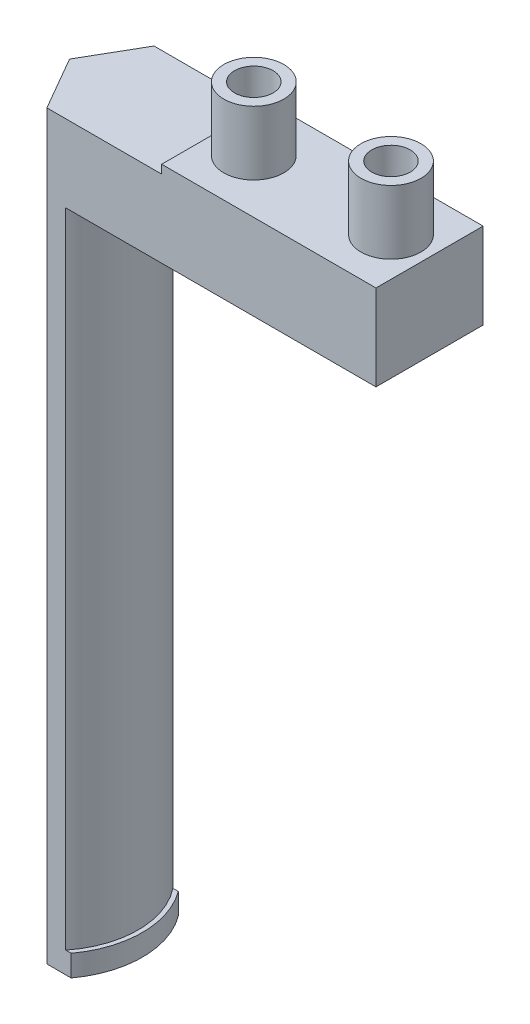
ISO-10303-21;
HEADER;
FILE_DESCRIPTION(('STEP AP214'),'2;1');
FILE_NAME('part.step','',(''),(''),'','','');
FILE_SCHEMA(('AUTOMOTIVE_DESIGN { 1 0 10303 214 1 1 1 1 }'));
ENDSEC;
DATA;
#1=APPLICATION_CONTEXT('core data for automotive mechanical design processes');
#2=APPLICATION_PROTOCOL_DEFINITION('international standard','automotive_design',2000,#1);
#3=PRODUCT_CONTEXT('',#1,'mechanical');
#4=PRODUCT('Part','Part','',(#3));
#5=PRODUCT_RELATED_PRODUCT_CATEGORY('part','',(#4));
#6=PRODUCT_DEFINITION_FORMATION('','',#4);
#7=PRODUCT_DEFINITION_CONTEXT('part definition',#1,'design');
#8=PRODUCT_DEFINITION('design','',#6,#7);
#9=PRODUCT_DEFINITION_SHAPE('','',#8);
#10=(LENGTH_UNIT() NAMED_UNIT(*) SI_UNIT(.MILLI.,.METRE.));
#11=(NAMED_UNIT(*) PLANE_ANGLE_UNIT() SI_UNIT($,.RADIAN.));
#12=(NAMED_UNIT(*) SI_UNIT($,.STERADIAN.) SOLID_ANGLE_UNIT());
#13=UNCERTAINTY_MEASURE_WITH_UNIT(LENGTH_MEASURE(1.E-05),#10,'distance_accuracy_value','');
#14=(GEOMETRIC_REPRESENTATION_CONTEXT(3) GLOBAL_UNCERTAINTY_ASSIGNED_CONTEXT((#13)) GLOBAL_UNIT_ASSIGNED_CONTEXT((#10,
#11,#12)) REPRESENTATION_CONTEXT('',''));
#15=CARTESIAN_POINT('',(0.,0.,0.));
#16=DIRECTION('',(0.,0.,1.));
#17=DIRECTION('',(1.,0.,0.));
#18=AXIS2_PLACEMENT_3D('',#15,#16,#17);
#19=CARTESIAN_POINT('',(-68.4126587736529,27.4010649474121,39.4980669589463));
#20=DIRECTION('',(0.86602540378444,0.,-0.499999999999998));
#21=DIRECTION('',(-0.499999999999998,0.,-0.86602540378444));
#22=AXIS2_PLACEMENT_3D('',#19,#20,#21);
#23=PLANE('',#22);
#24=DIRECTION('',(0.499999999999999,0.,0.86602540378444));
#25=VECTOR('',#24,1.);
#26=CARTESIAN_POINT('',(-68.4126587736529,-2.00000000000001,39.4980669589463));
#27=LINE('',#26,#25);
#28=CARTESIAN_POINT('',(-84.,-2.00000000000001,12.5));
#29=VERTEX_POINT('',#28);
#30=CARTESIAN_POINT('',(-76.7831216351297,-2.00000000000001,25.));
#31=VERTEX_POINT('',#30);
#32=EDGE_CURVE('E139',#29,#31,#27,.T.);
#33=ORIENTED_EDGE('',*,*,#32,.F.);
#34=DIRECTION('',(0.,-1.,0.));
#35=VECTOR('',#34,1.);
#36=CARTESIAN_POINT('',(-84.,27.4010649474121,12.5));
#37=LINE('',#36,#35);
#38=CARTESIAN_POINT('',(-84.,-175.,12.5));
#39=VERTEX_POINT('',#38);
#40=EDGE_CURVE('E66',#29,#39,#37,.T.);
#41=ORIENTED_EDGE('',*,*,#40,.T.);
#42=DIRECTION('',(-0.499999999999998,0.,-0.86602540378444));
#43=VECTOR('',#42,1.);
#44=CARTESIAN_POINT('',(-76.7831216351297,-175.,25.));
#45=LINE('',#44,#43);
#46=CARTESIAN_POINT('',(-76.7831216351297,-175.,25.));
#47=VERTEX_POINT('',#46);
#48=EDGE_CURVE('E162',#47,#39,#45,.T.);
#49=ORIENTED_EDGE('',*,*,#48,.F.);
#50=DIRECTION('',(0.,-1.,0.));
#51=VECTOR('',#50,1.);
#52=CARTESIAN_POINT('',(-76.7831216351297,27.4010649474121,25.));
#53=LINE('',#52,#51);
#54=EDGE_CURVE('E176',#31,#47,#53,.T.);
#55=ORIENTED_EDGE('',*,*,#54,.F.);
#56=EDGE_LOOP('',(#33,#41,#49,#55));
#57=FACE_BOUND('',#56,.T.);
#58=ADVANCED_FACE('F42',(#57),#23,.F.);
#59=CARTESIAN_POINT('',(-57.5873412263474,27.4010649474121,-33.2480669589463));
#60=DIRECTION('',(-0.86602540378444,0.,-0.499999999999998));
#61=DIRECTION('',(-0.499999999999998,0.,0.86602540378444));
#62=AXIS2_PLACEMENT_3D('',#59,#60,#61);
#63=PLANE('',#62);
#64=ORIENTED_EDGE('',*,*,#40,.F.);
#65=DIRECTION('',(-0.499999999999998,0.,0.86602540378444));
#66=VECTOR('',#65,1.);
#67=CARTESIAN_POINT('',(-57.5873412263475,-2.00000000000001,-33.2480669589463));
#68=LINE('',#67,#66);
#69=CARTESIAN_POINT('',(-76.7831216351297,-2.00000000000001,0.));
#70=VERTEX_POINT('',#69);
#71=EDGE_CURVE('E155',#70,#29,#68,.T.);
#72=ORIENTED_EDGE('',*,*,#71,.F.);
#73=DIRECTION('',(0.,-1.,0.));
#74=VECTOR('',#73,1.);
#75=CARTESIAN_POINT('',(-76.7831216351297,27.4010649474121,0.));
#76=LINE('',#75,#74);
#77=CARTESIAN_POINT('',(-76.7831216351297,-175.,0.));
#78=VERTEX_POINT('',#77);
#79=EDGE_CURVE('E175',#70,#78,#76,.T.);
#80=ORIENTED_EDGE('',*,*,#79,.T.);
#81=DIRECTION('',(0.499999999999997,0.,-0.866025403784441));
#82=VECTOR('',#81,1.);
#83=CARTESIAN_POINT('',(-84.,-175.,12.5));
#84=LINE('',#83,#82);
#85=EDGE_CURVE('E165',#39,#78,#84,.T.);
#86=ORIENTED_EDGE('',*,*,#85,.F.);
#87=EDGE_LOOP('',(#64,#72,#80,#86));
#88=FACE_BOUND('',#87,.T.);
#89=ADVANCED_FACE('F302',(#88),#63,.T.);
#90=CARTESIAN_POINT('',(0.,0.,0.));
#91=DIRECTION('',(0.,0.,1.));
#92=DIRECTION('',(1.,0.,0.));
#93=AXIS2_PLACEMENT_3D('',#90,#91,#92);
#94=PLANE('',#93);
#95=DIRECTION('',(-1.,0.,0.));
#96=VECTOR('',#95,1.);
#97=CARTESIAN_POINT('',(0.,-2.,0.));
#98=LINE('',#97,#96);
#99=CARTESIAN_POINT('',(-50.,-2.00000000000001,0.));
#100=VERTEX_POINT('',#99);
#101=EDGE_CURVE('E134',#100,#70,#98,.T.);
#102=ORIENTED_EDGE('',*,*,#101,.F.);
#103=DIRECTION('',(0.,1.,0.));
#104=VECTOR('',#103,1.);
#105=CARTESIAN_POINT('',(-50.,-2.00000000000001,0.));
#106=LINE('',#105,#104);
#107=CARTESIAN_POINT('',(-50.,0.,0.));
#108=VERTEX_POINT('',#107);
#109=EDGE_CURVE('E130',#100,#108,#106,.T.);
#110=ORIENTED_EDGE('',*,*,#109,.T.);
#111=DIRECTION('',(-1.,0.,0.));
#112=VECTOR('',#111,1.);
#113=CARTESIAN_POINT('',(0.,0.,0.));
#114=LINE('',#113,#112);
#115=CARTESIAN_POINT('',(0.,0.,0.));
#116=VERTEX_POINT('',#115);
#117=EDGE_CURVE('E270',#116,#108,#114,.T.);
#118=ORIENTED_EDGE('',*,*,#117,.F.);
#119=DIRECTION('',(0.,1.,0.));
#120=VECTOR('',#119,1.);
#121=CARTESIAN_POINT('',(0.,-20.,0.));
#122=LINE('',#121,#120);
#123=CARTESIAN_POINT('',(0.,-20.,0.));
#124=VERTEX_POINT('',#123);
#125=EDGE_CURVE('E249',#124,#116,#122,.T.);
#126=ORIENTED_EDGE('',*,*,#125,.F.);
#127=DIRECTION('',(1.,0.,0.));
#128=VECTOR('',#127,1.);
#129=CARTESIAN_POINT('',(-68.,-20.,0.));
#130=LINE('',#129,#128);
#131=CARTESIAN_POINT('',(-72.387505004004,-20.,0.));
#132=VERTEX_POINT('',#131);
#133=EDGE_CURVE('E257',#132,#124,#130,.T.);
#134=ORIENTED_EDGE('',*,*,#133,.F.);
#135=DIRECTION('',(0.,-1.,0.));
#136=VECTOR('',#135,1.);
#137=CARTESIAN_POINT('',(-72.387505004004,-6.75235114595193,0.));
#138=LINE('',#137,#136);
#139=CARTESIAN_POINT('',(-72.387505004004,-170.,0.));
#140=VERTEX_POINT('',#139);
#141=EDGE_CURVE('E191',#132,#140,#138,.T.);
#142=ORIENTED_EDGE('',*,*,#141,.T.);
#143=DIRECTION('',(-1.,0.,0.));
#144=VECTOR('',#143,1.);
#145=CARTESIAN_POINT('',(-48.,-170.,0.));
#146=LINE('',#145,#144);
#147=CARTESIAN_POINT('',(-71.1254629693138,-170.,0.));
#148=VERTEX_POINT('',#147);
#149=EDGE_CURVE('E274',#148,#140,#146,.T.);
#150=ORIENTED_EDGE('',*,*,#149,.F.);
#151=DIRECTION('',(0.,1.,0.));
#152=VECTOR('',#151,1.);
#153=CARTESIAN_POINT('',(-71.1254629693138,-234.055646191859,0.));
#154=LINE('',#153,#152);
#155=CARTESIAN_POINT('',(-71.1254629693138,-175.,0.));
#156=VERTEX_POINT('',#155);
#157=EDGE_CURVE('E188',#156,#148,#154,.T.);
#158=ORIENTED_EDGE('',*,*,#157,.F.);
#159=DIRECTION('',(1.,0.,0.));
#160=VECTOR('',#159,1.);
#161=CARTESIAN_POINT('',(-76.7831216351297,-175.,0.));
#162=LINE('',#161,#160);
#163=EDGE_CURVE('E169',#78,#156,#162,.T.);
#164=ORIENTED_EDGE('',*,*,#163,.F.);
#165=ORIENTED_EDGE('',*,*,#79,.F.);
#166=EDGE_LOOP('',(#102,#110,#118,#126,#134,#142,#150,#158,#164,#165));
#167=FACE_BOUND('',#166,.T.);
#168=ADVANCED_FACE('F291',(#167),#94,.F.);
#169=CARTESIAN_POINT('',(0.,0.,25.));
#170=DIRECTION('',(0.,0.,1.));
#171=DIRECTION('',(1.,0.,0.));
#172=AXIS2_PLACEMENT_3D('',#169,#170,#171);
#173=PLANE('',#172);
#174=DIRECTION('',(0.,1.,0.));
#175=VECTOR('',#174,1.);
#176=CARTESIAN_POINT('',(-50.,-2.00000000000001,25.));
#177=LINE('',#176,#175);
#178=CARTESIAN_POINT('',(-50.,-2.00000000000001,25.));
#179=VERTEX_POINT('',#178);
#180=CARTESIAN_POINT('',(-50.,0.,25.));
#181=VERTEX_POINT('',#180);
#182=EDGE_CURVE('E58',#179,#181,#177,.T.);
#183=ORIENTED_EDGE('',*,*,#182,.F.);
#184=DIRECTION('',(1.,0.,0.));
#185=VECTOR('',#184,1.);
#186=CARTESIAN_POINT('',(0.,-2.,25.));
#187=LINE('',#186,#185);
#188=EDGE_CURVE('E135',#31,#179,#187,.T.);
#189=ORIENTED_EDGE('',*,*,#188,.F.);
#190=ORIENTED_EDGE('',*,*,#54,.T.);
#191=DIRECTION('',(-1.,0.,0.));
#192=VECTOR('',#191,1.);
#193=CARTESIAN_POINT('',(-71.1254629693138,-175.,25.));
#194=LINE('',#193,#192);
#195=CARTESIAN_POINT('',(-71.1254629693138,-175.,25.));
#196=VERTEX_POINT('',#195);
#197=EDGE_CURVE('E153',#196,#47,#194,.T.);
#198=ORIENTED_EDGE('',*,*,#197,.F.);
#199=DIRECTION('',(0.,1.,0.));
#200=VECTOR('',#199,1.);
#201=CARTESIAN_POINT('',(-71.1254629693138,-234.055646191859,25.));
#202=LINE('',#201,#200);
#203=CARTESIAN_POINT('',(-71.1254629693138,-170.,25.));
#204=VERTEX_POINT('',#203);
#205=EDGE_CURVE('E187',#196,#204,#202,.T.);
#206=ORIENTED_EDGE('',*,*,#205,.T.);
#207=DIRECTION('',(-1.,0.,0.));
#208=VECTOR('',#207,1.);
#209=CARTESIAN_POINT('',(-48.,-170.,25.));
#210=LINE('',#209,#208);
#211=CARTESIAN_POINT('',(-72.387505004004,-170.,25.));
#212=VERTEX_POINT('',#211);
#213=EDGE_CURVE('E260',#204,#212,#210,.T.);
#214=ORIENTED_EDGE('',*,*,#213,.T.);
#215=DIRECTION('',(0.,-1.,0.));
#216=VECTOR('',#215,1.);
#217=CARTESIAN_POINT('',(-72.387505004004,-6.75235114595193,25.));
#218=LINE('',#217,#216);
#219=CARTESIAN_POINT('',(-72.387505004004,-20.,25.));
#220=VERTEX_POINT('',#219);
#221=EDGE_CURVE('E201',#220,#212,#218,.T.);
#222=ORIENTED_EDGE('',*,*,#221,.F.);
#223=DIRECTION('',(1.,0.,0.));
#224=VECTOR('',#223,1.);
#225=CARTESIAN_POINT('',(-68.,-20.,25.));
#226=LINE('',#225,#224);
#227=CARTESIAN_POINT('',(0.,-20.,25.));
#228=VERTEX_POINT('',#227);
#229=EDGE_CURVE('E263',#220,#228,#226,.T.);
#230=ORIENTED_EDGE('',*,*,#229,.T.);
#231=DIRECTION('',(0.,1.,0.));
#232=VECTOR('',#231,1.);
#233=CARTESIAN_POINT('',(0.,-20.,25.));
#234=LINE('',#233,#232);
#235=CARTESIAN_POINT('',(0.,0.,25.));
#236=VERTEX_POINT('',#235);
#237=EDGE_CURVE('E254',#228,#236,#234,.T.);
#238=ORIENTED_EDGE('',*,*,#237,.T.);
#239=DIRECTION('',(-1.,0.,0.));
#240=VECTOR('',#239,1.);
#241=CARTESIAN_POINT('',(0.,0.,25.));
#242=LINE('',#241,#240);
#243=EDGE_CURVE('E148',#236,#181,#242,.T.);
#244=ORIENTED_EDGE('',*,*,#243,.T.);
#245=EDGE_LOOP('',(#183,#189,#190,#198,#206,#214,#222,#230,#238,#244));
#246=FACE_BOUND('',#245,.T.);
#247=ADVANCED_FACE('F146',(#246),#173,.T.);
#248=CARTESIAN_POINT('',(-88.,-234.055646191859,12.5));
#249=DIRECTION('',(0.,1.,0.));
#250=DIRECTION('',(0.,0.,1.));
#251=AXIS2_PLACEMENT_3D('',#248,#249,#250);
#252=CYLINDRICAL_SURFACE('',#251,21.);
#253=ORIENTED_EDGE('',*,*,#205,.F.);
#254=CARTESIAN_POINT('',(-88.,-175.,12.5));
#255=DIRECTION('',(0.,-1.,0.));
#256=DIRECTION('',(0.,0.,-1.));
#257=AXIS2_PLACEMENT_3D('',#254,#255,#256);
#258=CIRCLE('',#257,21.);
#259=EDGE_CURVE('E172',#156,#196,#258,.T.);
#260=ORIENTED_EDGE('',*,*,#259,.F.);
#261=ORIENTED_EDGE('',*,*,#157,.T.);
#262=CARTESIAN_POINT('',(-88.,-170.,12.5));
#263=DIRECTION('',(0.,1.,0.));
#264=DIRECTION('',(0.,0.,1.));
#265=AXIS2_PLACEMENT_3D('',#262,#263,#264);
#266=CIRCLE('',#265,21.);
#267=EDGE_CURVE('E179',#204,#148,#266,.T.);
#268=ORIENTED_EDGE('',*,*,#267,.F.);
#269=EDGE_LOOP('',(#253,#260,#261,#268));
#270=FACE_BOUND('',#269,.T.);
#271=ADVANCED_FACE('F311',(#270),#252,.T.);
#272=CARTESIAN_POINT('',(-48.,-170.,25.));
#273=DIRECTION('',(0.,-1.,0.));
#274=DIRECTION('',(0.,0.,-1.));
#275=AXIS2_PLACEMENT_3D('',#272,#273,#274);
#276=PLANE('',#275);
#277=ORIENTED_EDGE('',*,*,#267,.T.);
#278=ORIENTED_EDGE('',*,*,#149,.T.);
#279=CARTESIAN_POINT('',(-88.,-170.,12.5));
#280=DIRECTION('',(0.,1.,0.));
#281=DIRECTION('',(0.,0.,1.));
#282=AXIS2_PLACEMENT_3D('',#279,#280,#281);
#283=CIRCLE('',#282,20.);
#284=EDGE_CURVE('E197',#212,#140,#283,.T.);
#285=ORIENTED_EDGE('',*,*,#284,.F.);
#286=ORIENTED_EDGE('',*,*,#213,.F.);
#287=EDGE_LOOP('',(#277,#278,#285,#286));
#288=FACE_BOUND('',#287,.T.);
#289=ADVANCED_FACE('F314',(#288),#276,.F.);
#290=CARTESIAN_POINT('',(0.,-20.,25.));
#291=DIRECTION('',(-1.,0.,0.));
#292=DIRECTION('',(0.,0.,1.));
#293=AXIS2_PLACEMENT_3D('',#290,#291,#292);
#294=PLANE('',#293);
#295=ORIENTED_EDGE('',*,*,#125,.T.);
#296=DIRECTION('',(0.,0.,-1.));
#297=VECTOR('',#296,1.);
#298=CARTESIAN_POINT('',(0.,0.,25.));
#299=LINE('',#298,#297);
#300=EDGE_CURVE('E253',#236,#116,#299,.T.);
#301=ORIENTED_EDGE('',*,*,#300,.F.);
#302=ORIENTED_EDGE('',*,*,#237,.F.);
#303=DIRECTION('',(0.,0.,-1.));
#304=VECTOR('',#303,1.);
#305=CARTESIAN_POINT('',(0.,-20.,25.));
#306=LINE('',#305,#304);
#307=EDGE_CURVE('E266',#228,#124,#306,.T.);
#308=ORIENTED_EDGE('',*,*,#307,.T.);
#309=EDGE_LOOP('',(#295,#301,#302,#308));
#310=FACE_BOUND('',#309,.T.);
#311=ADVANCED_FACE('F44',(#310),#294,.F.);
#312=CARTESIAN_POINT('',(0.,0.,25.));
#313=DIRECTION('',(0.,-1.,0.));
#314=DIRECTION('',(1.,0.,0.));
#315=AXIS2_PLACEMENT_3D('',#312,#313,#314);
#316=PLANE('',#315);
#317=CARTESIAN_POINT('',(-9.,0.,12.5));
#318=DIRECTION('',(0.,-1.,0.));
#319=DIRECTION('',(1.,0.,0.));
#320=AXIS2_PLACEMENT_3D('',#317,#318,#319);
#321=CIRCLE('',#320,7.);
#322=CARTESIAN_POINT('',(-2.,0.,12.5));
#323=VERTEX_POINT('',#322);
#324=EDGE_CURVE('E11',#323,#323,#321,.F.);
#325=ORIENTED_EDGE('',*,*,#324,.F.);
#326=EDGE_LOOP('',(#325));
#327=FACE_BOUND('',#326,.T.);
#328=CARTESIAN_POINT('',(-41.,0.,12.5));
#329=DIRECTION('',(0.,1.,0.));
#330=DIRECTION('',(-1.,0.,0.));
#331=AXIS2_PLACEMENT_3D('',#328,#329,#330);
#332=CIRCLE('',#331,7.);
#333=CARTESIAN_POINT('',(-48.,0.,12.5));
#334=VERTEX_POINT('',#333);
#335=EDGE_CURVE('E51',#334,#334,#332,.T.);
#336=ORIENTED_EDGE('',*,*,#335,.F.);
#337=EDGE_LOOP('',(#336));
#338=FACE_BOUND('',#337,.T.);
#339=ORIENTED_EDGE('',*,*,#117,.T.);
#340=DIRECTION('',(0.,0.,-1.));
#341=VECTOR('',#340,1.);
#342=CARTESIAN_POINT('',(-50.,0.,0.));
#343=LINE('',#342,#341);
#344=EDGE_CURVE('E143',#181,#108,#343,.T.);
#345=ORIENTED_EDGE('',*,*,#344,.F.);
#346=ORIENTED_EDGE('',*,*,#243,.F.);
#347=ORIENTED_EDGE('',*,*,#300,.T.);
#348=EDGE_LOOP('',(#339,#345,#346,#347));
#349=FACE_BOUND('',#348,.T.);
#350=ADVANCED_FACE('F285',(#327,#338,#349),#316,.F.);
#351=CARTESIAN_POINT('',(-68.,-20.,25.));
#352=DIRECTION('',(0.,1.,0.));
#353=DIRECTION('',(0.,0.,1.));
#354=AXIS2_PLACEMENT_3D('',#351,#352,#353);
#355=PLANE('',#354);
#356=CARTESIAN_POINT('',(-9.,-20.,12.5));
#357=DIRECTION('',(0.,-1.,0.));
#358=DIRECTION('',(0.,0.,-1.));
#359=AXIS2_PLACEMENT_3D('',#356,#357,#358);
#360=CIRCLE('',#359,7.5);
#361=CARTESIAN_POINT('',(-9.,-20.,5.));
#362=VERTEX_POINT('',#361);
#363=EDGE_CURVE('E206',#362,#362,#360,.T.);
#364=ORIENTED_EDGE('',*,*,#363,.F.);
#365=EDGE_LOOP('',(#364));
#366=FACE_BOUND('',#365,.T.);
#367=CARTESIAN_POINT('',(-41.,-20.,12.5));
#368=DIRECTION('',(0.,-1.,0.));
#369=DIRECTION('',(0.,0.,-1.));
#370=AXIS2_PLACEMENT_3D('',#367,#368,#369);
#371=CIRCLE('',#370,7.5);
#372=CARTESIAN_POINT('',(-41.,-20.,5.));
#373=VERTEX_POINT('',#372);
#374=EDGE_CURVE('E225',#373,#373,#371,.T.);
#375=ORIENTED_EDGE('',*,*,#374,.F.);
#376=EDGE_LOOP('',(#375));
#377=FACE_BOUND('',#376,.T.);
#378=ORIENTED_EDGE('',*,*,#133,.T.);
#379=ORIENTED_EDGE('',*,*,#307,.F.);
#380=ORIENTED_EDGE('',*,*,#229,.F.);
#381=CARTESIAN_POINT('',(-88.,-20.,12.5));
#382=DIRECTION('',(0.,1.,0.));
#383=DIRECTION('',(0.,0.,1.));
#384=AXIS2_PLACEMENT_3D('',#381,#382,#383);
#385=CIRCLE('',#384,20.);
#386=EDGE_CURVE('E202',#220,#132,#385,.T.);
#387=ORIENTED_EDGE('',*,*,#386,.T.);
#388=EDGE_LOOP('',(#378,#379,#380,#387));
#389=FACE_BOUND('',#388,.T.);
#390=ADVANCED_FACE('F323',(#366,#377,#389),#355,.F.);
#391=CARTESIAN_POINT('',(-41.,14.91,12.5));
#392=DIRECTION('',(0.,-1.,0.));
#393=DIRECTION('',(1.,0.,0.));
#394=AXIS2_PLACEMENT_3D('',#391,#392,#393);
#395=CYLINDRICAL_SURFACE('',#394,7.);
#396=CARTESIAN_POINT('',(-41.,14.91,12.5));
#397=DIRECTION('',(0.,1.,0.));
#398=DIRECTION('',(-1.,0.,0.));
#399=AXIS2_PLACEMENT_3D('',#396,#397,#398);
#400=CIRCLE('',#399,7.);
#401=CARTESIAN_POINT('',(-48.,14.91,12.5));
#402=VERTEX_POINT('',#401);
#403=EDGE_CURVE('E245',#402,#402,#400,.T.);
#404=ORIENTED_EDGE('',*,*,#403,.F.);
#405=EDGE_LOOP('',(#404));
#406=FACE_BOUND('',#405,.T.);
#407=ORIENTED_EDGE('',*,*,#335,.T.);
#408=EDGE_LOOP('',(#407));
#409=FACE_BOUND('',#408,.T.);
#410=ADVANCED_FACE('F325',(#406,#409),#395,.T.);
#411=CARTESIAN_POINT('',(-41.,14.91,12.5));
#412=DIRECTION('',(0.,1.,0.));
#413=DIRECTION('',(-1.,0.,0.));
#414=AXIS2_PLACEMENT_3D('',#411,#412,#413);
#415=PLANE('',#414);
#416=CARTESIAN_POINT('',(-41.,14.91,12.5));
#417=DIRECTION('',(0.,-1.,0.));
#418=DIRECTION('',(0.,0.,-1.));
#419=AXIS2_PLACEMENT_3D('',#416,#417,#418);
#420=CIRCLE('',#419,4.49999999999999);
#421=CARTESIAN_POINT('',(-41.,14.91,8.00000000000001));
#422=VERTEX_POINT('',#421);
#423=EDGE_CURVE('E237',#422,#422,#420,.T.);
#424=ORIENTED_EDGE('',*,*,#423,.T.);
#425=EDGE_LOOP('',(#424));
#426=FACE_BOUND('',#425,.T.);
#427=ORIENTED_EDGE('',*,*,#403,.T.);
#428=EDGE_LOOP('',(#427));
#429=FACE_BOUND('',#428,.T.);
#430=ADVANCED_FACE('F332',(#426,#429),#415,.T.);
#431=CARTESIAN_POINT('',(-9.,14.91,12.5));
#432=DIRECTION('',(0.,-1.,0.));
#433=DIRECTION('',(1.,0.,0.));
#434=AXIS2_PLACEMENT_3D('',#431,#432,#433);
#435=CYLINDRICAL_SURFACE('',#434,7.);
#436=CARTESIAN_POINT('',(-9.,14.91,12.5));
#437=DIRECTION('',(0.,1.,0.));
#438=DIRECTION('',(-1.,0.,0.));
#439=AXIS2_PLACEMENT_3D('',#436,#437,#438);
#440=CIRCLE('',#439,7.);
#441=CARTESIAN_POINT('',(-16.,14.91,12.5));
#442=VERTEX_POINT('',#441);
#443=EDGE_CURVE('E241',#442,#442,#440,.T.);
#444=ORIENTED_EDGE('',*,*,#443,.F.);
#445=EDGE_LOOP('',(#444));
#446=FACE_BOUND('',#445,.T.);
#447=ORIENTED_EDGE('',*,*,#324,.T.);
#448=EDGE_LOOP('',(#447));
#449=FACE_BOUND('',#448,.T.);
#450=ADVANCED_FACE('F380',(#446,#449),#435,.T.);
#451=CARTESIAN_POINT('',(-9.,14.91,12.5));
#452=DIRECTION('',(0.,1.,0.));
#453=DIRECTION('',(-1.,0.,0.));
#454=AXIS2_PLACEMENT_3D('',#451,#452,#453);
#455=PLANE('',#454);
#456=CARTESIAN_POINT('',(-9.,14.91,12.5));
#457=DIRECTION('',(0.,-1.,0.));
#458=DIRECTION('',(0.,0.,-1.));
#459=AXIS2_PLACEMENT_3D('',#456,#457,#458);
#460=CIRCLE('',#459,4.49999999999999);
#461=CARTESIAN_POINT('',(-9.,14.91,8.00000000000001));
#462=VERTEX_POINT('',#461);
#463=EDGE_CURVE('E221',#462,#462,#460,.T.);
#464=ORIENTED_EDGE('',*,*,#463,.T.);
#465=EDGE_LOOP('',(#464));
#466=FACE_BOUND('',#465,.T.);
#467=ORIENTED_EDGE('',*,*,#443,.T.);
#468=EDGE_LOOP('',(#467));
#469=FACE_BOUND('',#468,.T.);
#470=ADVANCED_FACE('F376',(#466,#469),#455,.T.);
#471=CARTESIAN_POINT('',(-41.,-20.,12.5));
#472=DIRECTION('',(0.,-1.,0.));
#473=DIRECTION('',(0.,0.,-1.));
#474=AXIS2_PLACEMENT_3D('',#471,#472,#473);
#475=CYLINDRICAL_SURFACE('',#474,4.49999999999999);
#476=ORIENTED_EDGE('',*,*,#423,.F.);
#477=EDGE_LOOP('',(#476));
#478=FACE_BOUND('',#477,.T.);
#479=CARTESIAN_POINT('',(-41.,-11.4,12.5));
#480=DIRECTION('',(0.,-1.,0.));
#481=DIRECTION('',(0.,0.,-1.));
#482=AXIS2_PLACEMENT_3D('',#479,#480,#481);
#483=CIRCLE('',#482,4.5);
#484=CARTESIAN_POINT('',(-41.,-11.4,8.));
#485=VERTEX_POINT('',#484);
#486=EDGE_CURVE('E233',#485,#485,#483,.T.);
#487=ORIENTED_EDGE('',*,*,#486,.T.);
#488=EDGE_LOOP('',(#487));
#489=FACE_BOUND('',#488,.T.);
#490=ADVANCED_FACE('F372',(#478,#489),#475,.F.);
#491=CARTESIAN_POINT('',(-36.5,-11.4,12.5));
#492=DIRECTION('',(0.,1.,0.));
#493=DIRECTION('',(0.,0.,1.));
#494=AXIS2_PLACEMENT_3D('',#491,#492,#493);
#495=PLANE('',#494);
#496=ORIENTED_EDGE('',*,*,#486,.F.);
#497=EDGE_LOOP('',(#496));
#498=FACE_BOUND('',#497,.T.);
#499=CARTESIAN_POINT('',(-41.,-11.4,12.5));
#500=DIRECTION('',(0.,-1.,0.));
#501=DIRECTION('',(0.,0.,-1.));
#502=AXIS2_PLACEMENT_3D('',#499,#500,#501);
#503=CIRCLE('',#502,7.5);
#504=CARTESIAN_POINT('',(-41.,-11.4,5.));
#505=VERTEX_POINT('',#504);
#506=EDGE_CURVE('E229',#505,#505,#503,.T.);
#507=ORIENTED_EDGE('',*,*,#506,.T.);
#508=EDGE_LOOP('',(#507));
#509=FACE_BOUND('',#508,.T.);
#510=ADVANCED_FACE('F368',(#498,#509),#495,.F.);
#511=CARTESIAN_POINT('',(-41.,-20.,12.5));
#512=DIRECTION('',(0.,-1.,0.));
#513=DIRECTION('',(0.,0.,-1.));
#514=AXIS2_PLACEMENT_3D('',#511,#512,#513);
#515=CYLINDRICAL_SURFACE('',#514,7.5);
#516=ORIENTED_EDGE('',*,*,#506,.F.);
#517=EDGE_LOOP('',(#516));
#518=FACE_BOUND('',#517,.T.);
#519=ORIENTED_EDGE('',*,*,#374,.T.);
#520=EDGE_LOOP('',(#519));
#521=FACE_BOUND('',#520,.T.);
#522=ADVANCED_FACE('F364',(#518,#521),#515,.F.);
#523=CARTESIAN_POINT('',(-9.,-20.,12.5));
#524=DIRECTION('',(0.,-1.,0.));
#525=DIRECTION('',(0.,0.,-1.));
#526=AXIS2_PLACEMENT_3D('',#523,#524,#525);
#527=CYLINDRICAL_SURFACE('',#526,4.49999999999999);
#528=ORIENTED_EDGE('',*,*,#463,.F.);
#529=EDGE_LOOP('',(#528));
#530=FACE_BOUND('',#529,.T.);
#531=CARTESIAN_POINT('',(-9.,-11.4,12.5));
#532=DIRECTION('',(0.,-1.,0.));
#533=DIRECTION('',(0.,0.,-1.));
#534=AXIS2_PLACEMENT_3D('',#531,#532,#533);
#535=CIRCLE('',#534,4.5);
#536=CARTESIAN_POINT('',(-9.,-11.4,8.));
#537=VERTEX_POINT('',#536);
#538=EDGE_CURVE('E217',#537,#537,#535,.T.);
#539=ORIENTED_EDGE('',*,*,#538,.T.);
#540=EDGE_LOOP('',(#539));
#541=FACE_BOUND('',#540,.T.);
#542=ADVANCED_FACE('F360',(#530,#541),#527,.F.);
#543=CARTESIAN_POINT('',(-4.5,-11.4,12.5));
#544=DIRECTION('',(0.,1.,0.));
#545=DIRECTION('',(0.,0.,1.));
#546=AXIS2_PLACEMENT_3D('',#543,#544,#545);
#547=PLANE('',#546);
#548=ORIENTED_EDGE('',*,*,#538,.F.);
#549=EDGE_LOOP('',(#548));
#550=FACE_BOUND('',#549,.T.);
#551=CARTESIAN_POINT('',(-9.,-11.4,12.5));
#552=DIRECTION('',(0.,-1.,0.));
#553=DIRECTION('',(0.,0.,-1.));
#554=AXIS2_PLACEMENT_3D('',#551,#552,#553);
#555=CIRCLE('',#554,7.5);
#556=CARTESIAN_POINT('',(-9.,-11.4,5.));
#557=VERTEX_POINT('',#556);
#558=EDGE_CURVE('E213',#557,#557,#555,.T.);
#559=ORIENTED_EDGE('',*,*,#558,.T.);
#560=EDGE_LOOP('',(#559));
#561=FACE_BOUND('',#560,.T.);
#562=ADVANCED_FACE('F356',(#550,#561),#547,.F.);
#563=CARTESIAN_POINT('',(-9.,-20.,12.5));
#564=DIRECTION('',(0.,-1.,0.));
#565=DIRECTION('',(0.,0.,-1.));
#566=AXIS2_PLACEMENT_3D('',#563,#564,#565);
#567=CYLINDRICAL_SURFACE('',#566,7.5);
#568=ORIENTED_EDGE('',*,*,#558,.F.);
#569=EDGE_LOOP('',(#568));
#570=FACE_BOUND('',#569,.T.);
#571=ORIENTED_EDGE('',*,*,#363,.T.);
#572=EDGE_LOOP('',(#571));
#573=FACE_BOUND('',#572,.T.);
#574=ADVANCED_FACE('F353',(#570,#573),#567,.F.);
#575=CARTESIAN_POINT('',(-88.,-6.75235114595193,12.5));
#576=DIRECTION('',(0.,-1.,0.));
#577=DIRECTION('',(0.,0.,-1.));
#578=AXIS2_PLACEMENT_3D('',#575,#576,#577);
#579=CYLINDRICAL_SURFACE('',#578,20.);
#580=ORIENTED_EDGE('',*,*,#221,.T.);
#581=ORIENTED_EDGE('',*,*,#284,.T.);
#582=ORIENTED_EDGE('',*,*,#141,.F.);
#583=ORIENTED_EDGE('',*,*,#386,.F.);
#584=EDGE_LOOP('',(#580,#581,#582,#583));
#585=FACE_BOUND('',#584,.T.);
#586=ADVANCED_FACE('F320',(#585),#579,.T.);
#587=CARTESIAN_POINT('',(-88.,-175.,12.5));
#588=DIRECTION('',(0.,-1.,0.));
#589=DIRECTION('',(0.,0.,-1.));
#590=AXIS2_PLACEMENT_3D('',#587,#588,#589);
#591=PLANE('',#590);
#592=ORIENTED_EDGE('',*,*,#197,.T.);
#593=ORIENTED_EDGE('',*,*,#48,.T.);
#594=ORIENTED_EDGE('',*,*,#85,.T.);
#595=ORIENTED_EDGE('',*,*,#163,.T.);
#596=ORIENTED_EDGE('',*,*,#259,.T.);
#597=EDGE_LOOP('',(#592,#593,#594,#595,#596));
#598=FACE_BOUND('',#597,.T.);
#599=ADVANCED_FACE('F304',(#598),#591,.T.);
#600=CARTESIAN_POINT('',(-50.,-2.00000000000001,0.));
#601=DIRECTION('',(1.,0.,0.));
#602=DIRECTION('',(0.,1.,0.));
#603=AXIS2_PLACEMENT_3D('',#600,#601,#602);
#604=PLANE('',#603);
#605=ORIENTED_EDGE('',*,*,#344,.T.);
#606=ORIENTED_EDGE('',*,*,#109,.F.);
#607=DIRECTION('',(0.,0.,-1.));
#608=VECTOR('',#607,1.);
#609=CARTESIAN_POINT('',(-50.,-2.00000000000001,0.));
#610=LINE('',#609,#608);
#611=EDGE_CURVE('E126',#179,#100,#610,.T.);
#612=ORIENTED_EDGE('',*,*,#611,.F.);
#613=ORIENTED_EDGE('',*,*,#182,.T.);
#614=EDGE_LOOP('',(#605,#606,#612,#613));
#615=FACE_BOUND('',#614,.T.);
#616=ADVANCED_FACE('F128',(#615),#604,.F.);
#617=CARTESIAN_POINT('',(0.,-2.,0.));
#618=DIRECTION('',(0.,1.,0.));
#619=DIRECTION('',(-1.,0.,0.));
#620=AXIS2_PLACEMENT_3D('',#617,#618,#619);
#621=PLANE('',#620);
#622=ORIENTED_EDGE('',*,*,#188,.T.);
#623=ORIENTED_EDGE('',*,*,#611,.T.);
#624=ORIENTED_EDGE('',*,*,#101,.T.);
#625=ORIENTED_EDGE('',*,*,#71,.T.);
#626=ORIENTED_EDGE('',*,*,#32,.T.);
#627=EDGE_LOOP('',(#622,#623,#624,#625,#626));
#628=FACE_BOUND('',#627,.T.);
#629=ADVANCED_FACE('F138',(#628),#621,.T.);
#630=CLOSED_SHELL('',(#58,#89,#168,#247,#271,#289,#311,#350,#390,#410,#430,#450,#470,#490,#510,
#522,#542,#562,#574,#586,#599,#616,#629));
#631=MANIFOLD_SOLID_BREP('B2',#630);
#632=ADVANCED_BREP_SHAPE_REPRESENTATION('',(#18,#631),#14);
#633=SHAPE_DEFINITION_REPRESENTATION(#9,#632);
ENDSEC;
END-ISO-10303-21;
